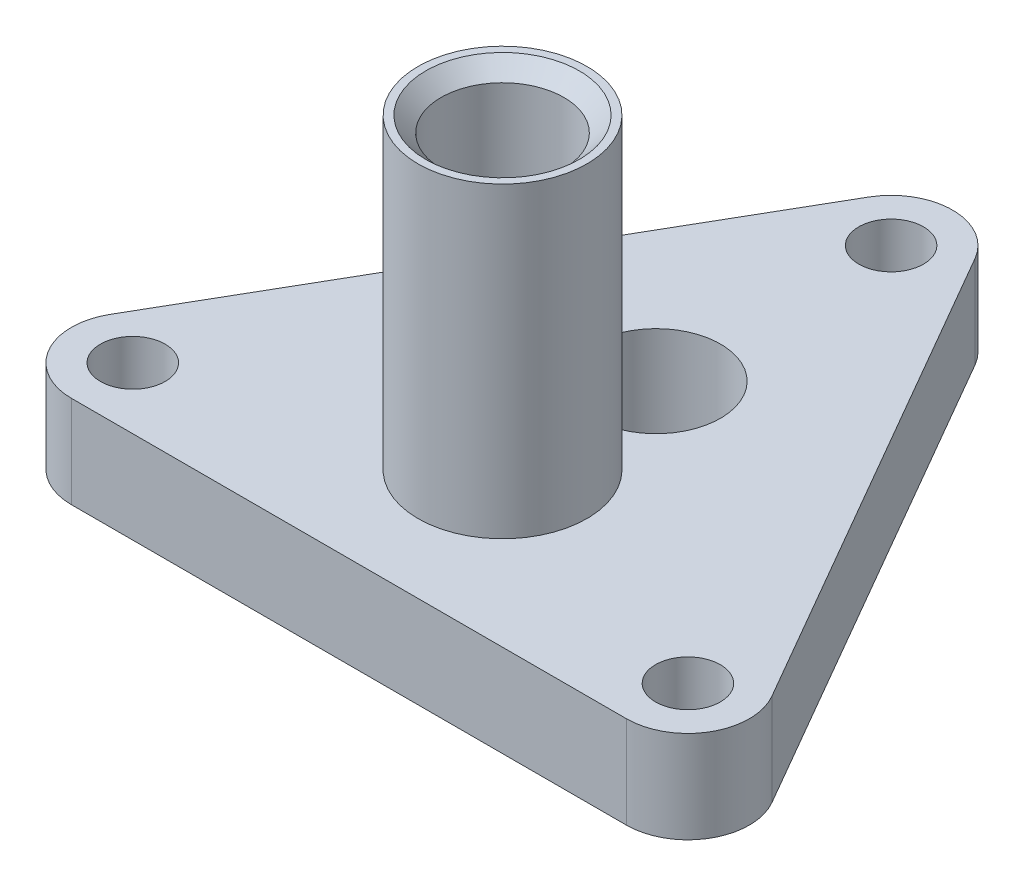
ISO-10303-21;
HEADER;
FILE_DESCRIPTION(('STEP AP214'),'2;1');
FILE_NAME('part.step','',(''),(''),'','','');
FILE_SCHEMA(('AUTOMOTIVE_DESIGN { 1 0 10303 214 1 1 1 1 }'));
ENDSEC;
DATA;
#1=APPLICATION_CONTEXT('core data for automotive mechanical design processes');
#2=APPLICATION_PROTOCOL_DEFINITION('international standard','automotive_design',2000,#1);
#3=PRODUCT_CONTEXT('',#1,'mechanical');
#4=PRODUCT('Part','Part','',(#3));
#5=PRODUCT_RELATED_PRODUCT_CATEGORY('part','',(#4));
#6=PRODUCT_DEFINITION_FORMATION('','',#4);
#7=PRODUCT_DEFINITION_CONTEXT('part definition',#1,'design');
#8=PRODUCT_DEFINITION('design','',#6,#7);
#9=PRODUCT_DEFINITION_SHAPE('','',#8);
#10=(LENGTH_UNIT() NAMED_UNIT(*) SI_UNIT(.MILLI.,.METRE.));
#11=(NAMED_UNIT(*) PLANE_ANGLE_UNIT() SI_UNIT($,.RADIAN.));
#12=(NAMED_UNIT(*) SI_UNIT($,.STERADIAN.) SOLID_ANGLE_UNIT());
#13=UNCERTAINTY_MEASURE_WITH_UNIT(LENGTH_MEASURE(1.E-05),#10,'distance_accuracy_value','');
#14=(GEOMETRIC_REPRESENTATION_CONTEXT(3) GLOBAL_UNCERTAINTY_ASSIGNED_CONTEXT((#13)) GLOBAL_UNIT_ASSIGNED_CONTEXT((#10,
#11,#12)) REPRESENTATION_CONTEXT('',''));
#15=CARTESIAN_POINT('',(0.,0.,0.));
#16=DIRECTION('',(0.,0.,1.));
#17=DIRECTION('',(1.,0.,0.));
#18=AXIS2_PLACEMENT_3D('',#15,#16,#17);
#19=CARTESIAN_POINT('',(0.,13.,-5.));
#20=DIRECTION('',(0.,1.,0.));
#21=DIRECTION('',(0.,0.,1.));
#22=AXIS2_PLACEMENT_3D('',#19,#20,#21);
#23=PLANE('',#22);
#24=CARTESIAN_POINT('',(0.,13.,-5.));
#25=DIRECTION('',(0.,1.,0.));
#26=DIRECTION('',(0.,0.,1.));
#27=AXIS2_PLACEMENT_3D('',#24,#25,#26);
#28=CIRCLE('',#27,2.5);
#29=CARTESIAN_POINT('',(0.,13.,-2.5));
#30=VERTEX_POINT('',#29);
#31=EDGE_CURVE('E11',#30,#30,#28,.F.);
#32=ORIENTED_EDGE('',*,*,#31,.T.);
#33=EDGE_LOOP('',(#32));
#34=FACE_BOUND('',#33,.T.);
#35=CARTESIAN_POINT('',(0.,13.,-5.));
#36=DIRECTION('',(0.,1.,0.));
#37=DIRECTION('',(0.,0.,1.));
#38=AXIS2_PLACEMENT_3D('',#35,#36,#37);
#39=CIRCLE('',#38,2.75);
#40=CARTESIAN_POINT('',(0.,13.,-2.25));
#41=VERTEX_POINT('',#40);
#42=EDGE_CURVE('E254',#41,#41,#39,.T.);
#43=ORIENTED_EDGE('',*,*,#42,.T.);
#44=EDGE_LOOP('',(#43));
#45=FACE_BOUND('',#44,.T.);
#46=ADVANCED_FACE('F33',(#34,#45),#23,.T.);
#47=CARTESIAN_POINT('',(9.0358983848623,3.,-2.));
#48=DIRECTION('',(0.,1.,0.));
#49=DIRECTION('',(0.,0.,1.));
#50=AXIS2_PLACEMENT_3D('',#47,#48,#49);
#51=PLANE('',#50);
#52=CARTESIAN_POINT('',(9.0358983848623,3.,-2.));
#53=DIRECTION('',(0.,1.,0.));
#54=DIRECTION('',(0.,0.,1.));
#55=AXIS2_PLACEMENT_3D('',#52,#53,#54);
#56=CIRCLE('',#55,1.054);
#57=CARTESIAN_POINT('',(9.0358983848623,3.,-0.946));
#58=VERTEX_POINT('',#57);
#59=EDGE_CURVE('E239',#58,#58,#56,.T.);
#60=ORIENTED_EDGE('',*,*,#59,.F.);
#61=EDGE_LOOP('',(#60));
#62=FACE_BOUND('',#61,.T.);
#63=CARTESIAN_POINT('',(1.90824453591173E-13,3.,-17.6506350946111));
#64=DIRECTION('',(0.,1.,0.));
#65=DIRECTION('',(0.,0.,1.));
#66=AXIS2_PLACEMENT_3D('',#63,#64,#65);
#67=CIRCLE('',#66,1.054);
#68=CARTESIAN_POINT('',(1.90824453591173E-13,3.,-16.5966350946111));
#69=VERTEX_POINT('',#68);
#70=EDGE_CURVE('E121',#69,#69,#67,.T.);
#71=ORIENTED_EDGE('',*,*,#70,.F.);
#72=EDGE_LOOP('',(#71));
#73=FACE_BOUND('',#72,.T.);
#74=DIRECTION('',(1.,0.,0.));
#75=VECTOR('',#74,1.);
#76=CARTESIAN_POINT('',(-9.03589838486198,3.,0.));
#77=LINE('',#76,#75);
#78=CARTESIAN_POINT('',(-9.03589838486198,3.,-1.07552855510562E-13));
#79=VERTEX_POINT('',#78);
#80=CARTESIAN_POINT('',(9.03589838486234,3.,0.));
#81=VERTEX_POINT('',#80);
#82=EDGE_CURVE('E86',#79,#81,#77,.T.);
#83=ORIENTED_EDGE('',*,*,#82,.T.);
#84=CARTESIAN_POINT('',(9.0358983848623,3.,-2.));
#85=DIRECTION('',(0.,1.,0.));
#86=DIRECTION('',(0.,0.,1.));
#87=AXIS2_PLACEMENT_3D('',#84,#85,#86);
#88=CIRCLE('',#87,2.00000000000002);
#89=CARTESIAN_POINT('',(10.7679491924312,3.,-2.99999999999997));
#90=VERTEX_POINT('',#89);
#91=EDGE_CURVE('E224',#81,#90,#88,.T.);
#92=ORIENTED_EDGE('',*,*,#91,.T.);
#93=DIRECTION('',(-0.499999999999992,0.,-0.866025403784444));
#94=VECTOR('',#93,1.);
#95=CARTESIAN_POINT('',(10.7679491924312,3.,-2.99999999999998));
#96=LINE('',#95,#94);
#97=CARTESIAN_POINT('',(1.73205080756922,3.,-18.6506350946109));
#98=VERTEX_POINT('',#97);
#99=EDGE_CURVE('E101',#90,#98,#96,.T.);
#100=ORIENTED_EDGE('',*,*,#99,.T.);
#101=CARTESIAN_POINT('',(1.90824453591173E-13,3.,-17.6506350946111));
#102=DIRECTION('',(0.,1.,0.));
#103=DIRECTION('',(0.,0.,1.));
#104=AXIS2_PLACEMENT_3D('',#101,#102,#103);
#105=CIRCLE('',#104,1.99999999999992);
#106=CARTESIAN_POINT('',(-1.73205080756865,3.,-18.650635094611));
#107=VERTEX_POINT('',#106);
#108=EDGE_CURVE('E94',#98,#107,#105,.T.);
#109=ORIENTED_EDGE('',*,*,#108,.T.);
#110=DIRECTION('',(-0.500000000000004,0.,0.866025403784436));
#111=VECTOR('',#110,1.);
#112=CARTESIAN_POINT('',(-1.73205080756854,3.,-18.6506350946109));
#113=LINE('',#112,#111);
#114=CARTESIAN_POINT('',(-10.7679491924308,3.,-3.00000000000001));
#115=VERTEX_POINT('',#114);
#116=EDGE_CURVE('E99',#107,#115,#113,.T.);
#117=ORIENTED_EDGE('',*,*,#116,.T.);
#118=CARTESIAN_POINT('',(-9.03589838486223,3.,-2.));
#119=DIRECTION('',(0.,1.,0.));
#120=DIRECTION('',(0.,0.,1.));
#121=AXIS2_PLACEMENT_3D('',#118,#119,#120);
#122=CIRCLE('',#121,1.99999999999989);
#123=EDGE_CURVE('E50',#115,#79,#122,.T.);
#124=ORIENTED_EDGE('',*,*,#123,.T.);
#125=EDGE_LOOP('',(#83,#92,#100,#109,#117,#124));
#126=FACE_BOUND('',#125,.T.);
#127=CARTESIAN_POINT('',(-9.03589838486223,3.,-2.));
#128=DIRECTION('',(0.,1.,0.));
#129=DIRECTION('',(0.,0.,1.));
#130=AXIS2_PLACEMENT_3D('',#127,#128,#129);
#131=CIRCLE('',#130,1.054);
#132=CARTESIAN_POINT('',(-9.03589838486223,3.,-0.945999999999999));
#133=VERTEX_POINT('',#132);
#134=EDGE_CURVE('E233',#133,#133,#131,.T.);
#135=ORIENTED_EDGE('',*,*,#134,.F.);
#136=EDGE_LOOP('',(#135));
#137=FACE_BOUND('',#136,.T.);
#138=CARTESIAN_POINT('',(0.,3.,-10.0000000000001));
#139=DIRECTION('',(0.,1.,0.));
#140=DIRECTION('',(0.,0.,1.));
#141=AXIS2_PLACEMENT_3D('',#138,#139,#140);
#142=CIRCLE('',#141,2.0955);
#143=CARTESIAN_POINT('',(0.,3.,-7.90450000000011));
#144=VERTEX_POINT('',#143);
#145=EDGE_CURVE('E251',#144,#144,#142,.T.);
#146=ORIENTED_EDGE('',*,*,#145,.F.);
#147=EDGE_LOOP('',(#146));
#148=FACE_BOUND('',#147,.T.);
#149=CARTESIAN_POINT('',(0.,3.,-5.));
#150=DIRECTION('',(0.,1.,0.));
#151=DIRECTION('',(0.,0.,1.));
#152=AXIS2_PLACEMENT_3D('',#149,#150,#151);
#153=CIRCLE('',#152,2.75);
#154=CARTESIAN_POINT('',(0.,3.,-2.25));
#155=VERTEX_POINT('',#154);
#156=EDGE_CURVE('E257',#155,#155,#153,.T.);
#157=ORIENTED_EDGE('',*,*,#156,.F.);
#158=EDGE_LOOP('',(#157));
#159=FACE_BOUND('',#158,.T.);
#160=ADVANCED_FACE('F96',(#62,#73,#126,#137,#148,#159),#51,.T.);
#161=CARTESIAN_POINT('',(9.0358983848623,0.,-2.));
#162=DIRECTION('',(0.,1.,0.));
#163=DIRECTION('',(0.,0.,1.));
#164=AXIS2_PLACEMENT_3D('',#161,#162,#163);
#165=PLANE('',#164);
#166=CARTESIAN_POINT('',(0.,0.,-10.0000000000001));
#167=DIRECTION('',(0.,1.,0.));
#168=DIRECTION('',(0.,0.,1.));
#169=AXIS2_PLACEMENT_3D('',#166,#167,#168);
#170=CIRCLE('',#169,2.0955);
#171=CARTESIAN_POINT('',(0.,0.,-7.90450000000011));
#172=VERTEX_POINT('',#171);
#173=EDGE_CURVE('E250',#172,#172,#170,.T.);
#174=ORIENTED_EDGE('',*,*,#173,.T.);
#175=EDGE_LOOP('',(#174));
#176=FACE_BOUND('',#175,.T.);
#177=CARTESIAN_POINT('',(0.,0.,-5.));
#178=DIRECTION('',(0.,1.,0.));
#179=DIRECTION('',(0.,0.,1.));
#180=AXIS2_PLACEMENT_3D('',#177,#178,#179);
#181=CIRCLE('',#180,0.8);
#182=CARTESIAN_POINT('',(0.,0.,-4.2));
#183=VERTEX_POINT('',#182);
#184=EDGE_CURVE('E245',#183,#183,#181,.T.);
#185=ORIENTED_EDGE('',*,*,#184,.T.);
#186=EDGE_LOOP('',(#185));
#187=FACE_BOUND('',#186,.T.);
#188=CARTESIAN_POINT('',(-9.03589838486223,0.,-2.));
#189=DIRECTION('',(0.,1.,0.));
#190=DIRECTION('',(0.,0.,1.));
#191=AXIS2_PLACEMENT_3D('',#188,#189,#190);
#192=CIRCLE('',#191,1.054);
#193=CARTESIAN_POINT('',(-9.03589838486223,0.,-0.945999999999999));
#194=VERTEX_POINT('',#193);
#195=EDGE_CURVE('E236',#194,#194,#192,.T.);
#196=ORIENTED_EDGE('',*,*,#195,.T.);
#197=EDGE_LOOP('',(#196));
#198=FACE_BOUND('',#197,.T.);
#199=DIRECTION('',(1.,0.,0.));
#200=VECTOR('',#199,1.);
#201=CARTESIAN_POINT('',(0.,0.,0.));
#202=LINE('',#201,#200);
#203=CARTESIAN_POINT('',(-9.03589838486198,0.,-1.07552855510562E-13));
#204=VERTEX_POINT('',#203);
#205=CARTESIAN_POINT('',(9.03589838486234,0.,0.));
#206=VERTEX_POINT('',#205);
#207=EDGE_CURVE('E80',#204,#206,#202,.T.);
#208=ORIENTED_EDGE('',*,*,#207,.F.);
#209=CARTESIAN_POINT('',(-9.03589838486223,0.,-2.));
#210=DIRECTION('',(0.,1.,0.));
#211=DIRECTION('',(0.,0.,1.));
#212=AXIS2_PLACEMENT_3D('',#209,#210,#211);
#213=CIRCLE('',#212,1.99999999999989);
#214=CARTESIAN_POINT('',(-10.7679491924308,0.,-3.00000000000001));
#215=VERTEX_POINT('',#214);
#216=EDGE_CURVE('E127',#215,#204,#213,.T.);
#217=ORIENTED_EDGE('',*,*,#216,.F.);
#218=DIRECTION('',(-0.500000000000004,0.,0.866025403784436));
#219=VECTOR('',#218,1.);
#220=CARTESIAN_POINT('',(-1.73205080756854,0.,-18.6506350946109));
#221=LINE('',#220,#219);
#222=CARTESIAN_POINT('',(-1.73205080756865,0.,-18.650635094611));
#223=VERTEX_POINT('',#222);
#224=EDGE_CURVE('E73',#223,#215,#221,.T.);
#225=ORIENTED_EDGE('',*,*,#224,.F.);
#226=CARTESIAN_POINT('',(1.90824453591173E-13,0.,-17.6506350946111));
#227=DIRECTION('',(0.,1.,0.));
#228=DIRECTION('',(0.,0.,1.));
#229=AXIS2_PLACEMENT_3D('',#226,#227,#228);
#230=CIRCLE('',#229,1.99999999999992);
#231=CARTESIAN_POINT('',(1.73205080756922,0.,-18.6506350946109));
#232=VERTEX_POINT('',#231);
#233=EDGE_CURVE('E109',#232,#223,#230,.T.);
#234=ORIENTED_EDGE('',*,*,#233,.F.);
#235=DIRECTION('',(-0.499999999999992,0.,-0.866025403784444));
#236=VECTOR('',#235,1.);
#237=CARTESIAN_POINT('',(10.7679491924312,0.,-2.99999999999998));
#238=LINE('',#237,#236);
#239=CARTESIAN_POINT('',(10.7679491924312,0.,-2.99999999999997));
#240=VERTEX_POINT('',#239);
#241=EDGE_CURVE('E123',#240,#232,#238,.T.);
#242=ORIENTED_EDGE('',*,*,#241,.F.);
#243=CARTESIAN_POINT('',(9.0358983848623,0.,-2.));
#244=DIRECTION('',(0.,1.,0.));
#245=DIRECTION('',(0.,0.,1.));
#246=AXIS2_PLACEMENT_3D('',#243,#244,#245);
#247=CIRCLE('',#246,2.00000000000002);
#248=EDGE_CURVE('E120',#206,#240,#247,.T.);
#249=ORIENTED_EDGE('',*,*,#248,.F.);
#250=EDGE_LOOP('',(#208,#217,#225,#234,#242,#249));
#251=FACE_BOUND('',#250,.T.);
#252=CARTESIAN_POINT('',(1.90824453591173E-13,0.,-17.6506350946111));
#253=DIRECTION('',(0.,1.,0.));
#254=DIRECTION('',(0.,0.,1.));
#255=AXIS2_PLACEMENT_3D('',#252,#253,#254);
#256=CIRCLE('',#255,1.054);
#257=CARTESIAN_POINT('',(1.90824453591173E-13,0.,-16.5966350946111));
#258=VERTEX_POINT('',#257);
#259=EDGE_CURVE('E230',#258,#258,#256,.T.);
#260=ORIENTED_EDGE('',*,*,#259,.T.);
#261=EDGE_LOOP('',(#260));
#262=FACE_BOUND('',#261,.T.);
#263=CARTESIAN_POINT('',(9.0358983848623,0.,-2.));
#264=DIRECTION('',(0.,1.,0.));
#265=DIRECTION('',(0.,0.,1.));
#266=AXIS2_PLACEMENT_3D('',#263,#264,#265);
#267=CIRCLE('',#266,1.054);
#268=CARTESIAN_POINT('',(9.0358983848623,0.,-0.946));
#269=VERTEX_POINT('',#268);
#270=EDGE_CURVE('E242',#269,#269,#267,.T.);
#271=ORIENTED_EDGE('',*,*,#270,.T.);
#272=EDGE_LOOP('',(#271));
#273=FACE_BOUND('',#272,.T.);
#274=ADVANCED_FACE('F166',(#176,#187,#198,#251,#262,#273),#165,.F.);
#275=CARTESIAN_POINT('',(0.,3.,0.));
#276=DIRECTION('',(0.,0.,-1.));
#277=DIRECTION('',(-1.,0.,0.));
#278=AXIS2_PLACEMENT_3D('',#275,#276,#277);
#279=PLANE('',#278);
#280=ORIENTED_EDGE('',*,*,#207,.T.);
#281=DIRECTION('',(0.,-1.,0.));
#282=VECTOR('',#281,1.);
#283=CARTESIAN_POINT('',(9.03589838486234,3.,0.));
#284=LINE('',#283,#282);
#285=EDGE_CURVE('E136',#81,#206,#284,.T.);
#286=ORIENTED_EDGE('',*,*,#285,.F.);
#287=ORIENTED_EDGE('',*,*,#82,.F.);
#288=DIRECTION('',(0.,-1.,0.));
#289=VECTOR('',#288,1.);
#290=CARTESIAN_POINT('',(-9.03589838486198,3.,-1.07552855510562E-13));
#291=LINE('',#290,#289);
#292=EDGE_CURVE('E115',#79,#204,#291,.T.);
#293=ORIENTED_EDGE('',*,*,#292,.T.);
#294=EDGE_LOOP('',(#280,#286,#287,#293));
#295=FACE_BOUND('',#294,.T.);
#296=ADVANCED_FACE('F200',(#295),#279,.F.);
#297=CARTESIAN_POINT('',(9.0358983848623,3.,-2.));
#298=DIRECTION('',(0.,-1.,0.));
#299=DIRECTION('',(0.,0.,-1.));
#300=AXIS2_PLACEMENT_3D('',#297,#298,#299);
#301=CYLINDRICAL_SURFACE('',#300,2.00000000000002);
#302=ORIENTED_EDGE('',*,*,#248,.T.);
#303=DIRECTION('',(0.,-1.,0.));
#304=VECTOR('',#303,1.);
#305=CARTESIAN_POINT('',(10.7679491924312,3.,-2.99999999999997));
#306=LINE('',#305,#304);
#307=EDGE_CURVE('E133',#90,#240,#306,.T.);
#308=ORIENTED_EDGE('',*,*,#307,.F.);
#309=ORIENTED_EDGE('',*,*,#91,.F.);
#310=ORIENTED_EDGE('',*,*,#285,.T.);
#311=EDGE_LOOP('',(#302,#308,#309,#310));
#312=FACE_BOUND('',#311,.T.);
#313=ADVANCED_FACE('F212',(#312),#301,.T.);
#314=CARTESIAN_POINT('',(10.7679491924312,3.,-2.99999999999998));
#315=DIRECTION('',(-0.866025403784443,0.,0.499999999999991));
#316=DIRECTION('',(0.499999999999992,0.,0.866025403784444));
#317=AXIS2_PLACEMENT_3D('',#314,#315,#316);
#318=PLANE('',#317);
#319=ORIENTED_EDGE('',*,*,#241,.T.);
#320=DIRECTION('',(0.,-1.,0.));
#321=VECTOR('',#320,1.);
#322=CARTESIAN_POINT('',(1.73205080756922,3.,-18.6506350946109));
#323=LINE('',#322,#321);
#324=EDGE_CURVE('E110',#98,#232,#323,.T.);
#325=ORIENTED_EDGE('',*,*,#324,.F.);
#326=ORIENTED_EDGE('',*,*,#99,.F.);
#327=ORIENTED_EDGE('',*,*,#307,.T.);
#328=EDGE_LOOP('',(#319,#325,#326,#327));
#329=FACE_BOUND('',#328,.T.);
#330=ADVANCED_FACE('F209',(#329),#318,.F.);
#331=CARTESIAN_POINT('',(1.90824453591173E-13,3.,-17.6506350946111));
#332=DIRECTION('',(0.,-1.,0.));
#333=DIRECTION('',(0.,0.,-1.));
#334=AXIS2_PLACEMENT_3D('',#331,#332,#333);
#335=CYLINDRICAL_SURFACE('',#334,1.99999999999992);
#336=ORIENTED_EDGE('',*,*,#233,.T.);
#337=DIRECTION('',(0.,-1.,0.));
#338=VECTOR('',#337,1.);
#339=CARTESIAN_POINT('',(-1.73205080756865,3.,-18.650635094611));
#340=LINE('',#339,#338);
#341=EDGE_CURVE('E106',#107,#223,#340,.T.);
#342=ORIENTED_EDGE('',*,*,#341,.F.);
#343=ORIENTED_EDGE('',*,*,#108,.F.);
#344=ORIENTED_EDGE('',*,*,#324,.T.);
#345=EDGE_LOOP('',(#336,#342,#343,#344));
#346=FACE_BOUND('',#345,.T.);
#347=ADVANCED_FACE('F107',(#346),#335,.T.);
#348=CARTESIAN_POINT('',(-1.73205080756854,3.,-18.6506350946109));
#349=DIRECTION('',(0.866025403784436,0.,0.500000000000004));
#350=DIRECTION('',(0.500000000000004,0.,-0.866025403784436));
#351=AXIS2_PLACEMENT_3D('',#348,#349,#350);
#352=PLANE('',#351);
#353=ORIENTED_EDGE('',*,*,#224,.T.);
#354=DIRECTION('',(0.,-1.,0.));
#355=VECTOR('',#354,1.);
#356=CARTESIAN_POINT('',(-10.7679491924308,3.,-3.00000000000001));
#357=LINE('',#356,#355);
#358=EDGE_CURVE('E111',#115,#215,#357,.T.);
#359=ORIENTED_EDGE('',*,*,#358,.F.);
#360=ORIENTED_EDGE('',*,*,#116,.F.);
#361=ORIENTED_EDGE('',*,*,#341,.T.);
#362=EDGE_LOOP('',(#353,#359,#360,#361));
#363=FACE_BOUND('',#362,.T.);
#364=ADVANCED_FACE('F113',(#363),#352,.F.);
#365=CARTESIAN_POINT('',(-9.03589838486223,3.,-2.));
#366=DIRECTION('',(0.,-1.,0.));
#367=DIRECTION('',(0.,0.,-1.));
#368=AXIS2_PLACEMENT_3D('',#365,#366,#367);
#369=CYLINDRICAL_SURFACE('',#368,1.99999999999989);
#370=ORIENTED_EDGE('',*,*,#216,.T.);
#371=ORIENTED_EDGE('',*,*,#292,.F.);
#372=ORIENTED_EDGE('',*,*,#123,.F.);
#373=ORIENTED_EDGE('',*,*,#358,.T.);
#374=EDGE_LOOP('',(#370,#371,#372,#373));
#375=FACE_BOUND('',#374,.T.);
#376=ADVANCED_FACE('F195',(#375),#369,.T.);
#377=CARTESIAN_POINT('',(1.90824453591173E-13,3.,-17.6506350946111));
#378=DIRECTION('',(0.,-1.,0.));
#379=DIRECTION('',(0.,0.,-1.));
#380=AXIS2_PLACEMENT_3D('',#377,#378,#379);
#381=CYLINDRICAL_SURFACE('',#380,1.054);
#382=ORIENTED_EDGE('',*,*,#70,.T.);
#383=EDGE_LOOP('',(#382));
#384=FACE_BOUND('',#383,.T.);
#385=ORIENTED_EDGE('',*,*,#259,.F.);
#386=EDGE_LOOP('',(#385));
#387=FACE_BOUND('',#386,.T.);
#388=ADVANCED_FACE('F192',(#384,#387),#381,.F.);
#389=CARTESIAN_POINT('',(-9.03589838486223,3.,-2.));
#390=DIRECTION('',(0.,-1.,0.));
#391=DIRECTION('',(0.,0.,-1.));
#392=AXIS2_PLACEMENT_3D('',#389,#390,#391);
#393=CYLINDRICAL_SURFACE('',#392,1.054);
#394=ORIENTED_EDGE('',*,*,#134,.T.);
#395=EDGE_LOOP('',(#394));
#396=FACE_BOUND('',#395,.T.);
#397=ORIENTED_EDGE('',*,*,#195,.F.);
#398=EDGE_LOOP('',(#397));
#399=FACE_BOUND('',#398,.T.);
#400=ADVANCED_FACE('F188',(#396,#399),#393,.F.);
#401=CARTESIAN_POINT('',(9.0358983848623,3.,-2.));
#402=DIRECTION('',(0.,-1.,0.));
#403=DIRECTION('',(0.,0.,-1.));
#404=AXIS2_PLACEMENT_3D('',#401,#402,#403);
#405=CYLINDRICAL_SURFACE('',#404,1.054);
#406=ORIENTED_EDGE('',*,*,#59,.T.);
#407=EDGE_LOOP('',(#406));
#408=FACE_BOUND('',#407,.T.);
#409=ORIENTED_EDGE('',*,*,#270,.F.);
#410=EDGE_LOOP('',(#409));
#411=FACE_BOUND('',#410,.T.);
#412=ADVANCED_FACE('F184',(#408,#411),#405,.F.);
#413=CARTESIAN_POINT('',(0.,0.,-5.));
#414=DIRECTION('',(0.,1.,0.));
#415=DIRECTION('',(0.,0.,1.));
#416=AXIS2_PLACEMENT_3D('',#413,#414,#415);
#417=CYLINDRICAL_SURFACE('',#416,0.8);
#418=ORIENTED_EDGE('',*,*,#184,.F.);
#419=EDGE_LOOP('',(#418));
#420=FACE_BOUND('',#419,.T.);
#421=CARTESIAN_POINT('',(0.,3.,-5.));
#422=DIRECTION('',(0.,1.,0.));
#423=DIRECTION('',(0.,0.,1.));
#424=AXIS2_PLACEMENT_3D('',#421,#422,#423);
#425=CIRCLE('',#424,0.8);
#426=CARTESIAN_POINT('',(0.,3.,-4.2));
#427=VERTEX_POINT('',#426);
#428=EDGE_CURVE('E260',#427,#427,#425,.F.);
#429=ORIENTED_EDGE('',*,*,#428,.F.);
#430=EDGE_LOOP('',(#429));
#431=FACE_BOUND('',#430,.T.);
#432=ADVANCED_FACE('F180',(#420,#431),#417,.F.);
#433=CARTESIAN_POINT('',(0.,0.,-10.0000000000001));
#434=DIRECTION('',(0.,1.,0.));
#435=DIRECTION('',(0.,0.,1.));
#436=AXIS2_PLACEMENT_3D('',#433,#434,#435);
#437=CYLINDRICAL_SURFACE('',#436,2.0955);
#438=ORIENTED_EDGE('',*,*,#173,.F.);
#439=EDGE_LOOP('',(#438));
#440=FACE_BOUND('',#439,.T.);
#441=ORIENTED_EDGE('',*,*,#145,.T.);
#442=EDGE_LOOP('',(#441));
#443=FACE_BOUND('',#442,.T.);
#444=ADVANCED_FACE('F176',(#440,#443),#437,.F.);
#445=CARTESIAN_POINT('',(0.,13.,-5.));
#446=DIRECTION('',(0.,-1.,0.));
#447=DIRECTION('',(0.,0.,-1.));
#448=AXIS2_PLACEMENT_3D('',#445,#446,#447);
#449=CYLINDRICAL_SURFACE('',#448,2.75);
#450=ORIENTED_EDGE('',*,*,#42,.F.);
#451=EDGE_LOOP('',(#450));
#452=FACE_BOUND('',#451,.T.);
#453=ORIENTED_EDGE('',*,*,#156,.T.);
#454=EDGE_LOOP('',(#453));
#455=FACE_BOUND('',#454,.T.);
#456=ADVANCED_FACE('F173',(#452,#455),#449,.T.);
#457=CARTESIAN_POINT('',(0.,3.,-5.));
#458=DIRECTION('',(0.,1.,0.));
#459=DIRECTION('',(0.,0.,1.));
#460=AXIS2_PLACEMENT_3D('',#457,#458,#459);
#461=PLANE('',#460);
#462=CARTESIAN_POINT('',(0.,3.,-5.));
#463=DIRECTION('',(0.,1.,0.));
#464=DIRECTION('',(0.,0.,1.));
#465=AXIS2_PLACEMENT_3D('',#462,#463,#464);
#466=CIRCLE('',#465,1.2720595314676);
#467=CARTESIAN_POINT('',(0.,3.,-3.72794046853241));
#468=VERTEX_POINT('',#467);
#469=EDGE_CURVE('E139',#468,#468,#466,.T.);
#470=ORIENTED_EDGE('',*,*,#469,.T.);
#471=EDGE_LOOP('',(#470));
#472=FACE_BOUND('',#471,.T.);
#473=ORIENTED_EDGE('',*,*,#428,.T.);
#474=EDGE_LOOP('',(#473));
#475=FACE_BOUND('',#474,.T.);
#476=ADVANCED_FACE('F175',(#472,#475),#461,.T.);
#477=CARTESIAN_POINT('',(0.,13.001,-5.));
#478=DIRECTION('',(0.,-1.,0.));
#479=DIRECTION('',(0.,0.,-1.));
#480=AXIS2_PLACEMENT_3D('',#477,#478,#479);
#481=CYLINDRICAL_SURFACE('',#480,2.);
#482=CARTESIAN_POINT('',(0.,12.5,-5.));
#483=DIRECTION('',(0.,1.,0.));
#484=DIRECTION('',(0.,0.,1.));
#485=AXIS2_PLACEMENT_3D('',#482,#483,#484);
#486=CIRCLE('',#485,2.);
#487=CARTESIAN_POINT('',(0.,12.5,-3.));
#488=VERTEX_POINT('',#487);
#489=EDGE_CURVE('E42',#488,#488,#486,.T.);
#490=ORIENTED_EDGE('',*,*,#489,.T.);
#491=EDGE_LOOP('',(#490));
#492=FACE_BOUND('',#491,.T.);
#493=CARTESIAN_POINT('',(0.,4.99999999999997,-5.));
#494=DIRECTION('',(0.,1.,0.));
#495=DIRECTION('',(0.,0.,1.));
#496=AXIS2_PLACEMENT_3D('',#493,#494,#495);
#497=CIRCLE('',#496,2.);
#498=CARTESIAN_POINT('',(0.,4.99999999999997,-3.));
#499=VERTEX_POINT('',#498);
#500=EDGE_CURVE('E142',#499,#499,#497,.F.);
#501=ORIENTED_EDGE('',*,*,#500,.T.);
#502=EDGE_LOOP('',(#501));
#503=FACE_BOUND('',#502,.T.);
#504=ADVANCED_FACE('F147',(#492,#503),#481,.F.);
#505=CARTESIAN_POINT('',(0.,3.,-5.));
#506=DIRECTION('',(0.,1.,0.));
#507=DIRECTION('',(0.,0.,1.));
#508=AXIS2_PLACEMENT_3D('',#505,#506,#507);
#509=CONICAL_SURFACE('',#508,1.27205953146759,0.349065850398871);
#510=ORIENTED_EDGE('',*,*,#500,.F.);
#511=EDGE_LOOP('',(#510));
#512=FACE_BOUND('',#511,.T.);
#513=ORIENTED_EDGE('',*,*,#469,.F.);
#514=EDGE_LOOP('',(#513));
#515=FACE_BOUND('',#514,.T.);
#516=ADVANCED_FACE('F151',(#512,#515),#509,.F.);
#517=CARTESIAN_POINT('',(0.,12.5,-5.));
#518=DIRECTION('',(0.,1.,0.));
#519=DIRECTION('',(0.,0.,1.));
#520=AXIS2_PLACEMENT_3D('',#517,#518,#519);
#521=CONICAL_SURFACE('',#520,2.,0.785398163397448);
#522=ORIENTED_EDGE('',*,*,#31,.F.);
#523=EDGE_LOOP('',(#522));
#524=FACE_BOUND('',#523,.T.);
#525=ORIENTED_EDGE('',*,*,#489,.F.);
#526=EDGE_LOOP('',(#525));
#527=FACE_BOUND('',#526,.T.);
#528=ADVANCED_FACE('F35',(#524,#527),#521,.F.);
#529=CLOSED_SHELL('',(#46,#160,#274,#296,#313,#330,#347,#364,#376,#388,#400,#412,#432,#444,#456,
#476,#504,#516,#528));
#530=MANIFOLD_SOLID_BREP('B2',#529);
#531=ADVANCED_BREP_SHAPE_REPRESENTATION('',(#18,#530),#14);
#532=SHAPE_DEFINITION_REPRESENTATION(#9,#531);
ENDSEC;
END-ISO-10303-21;
